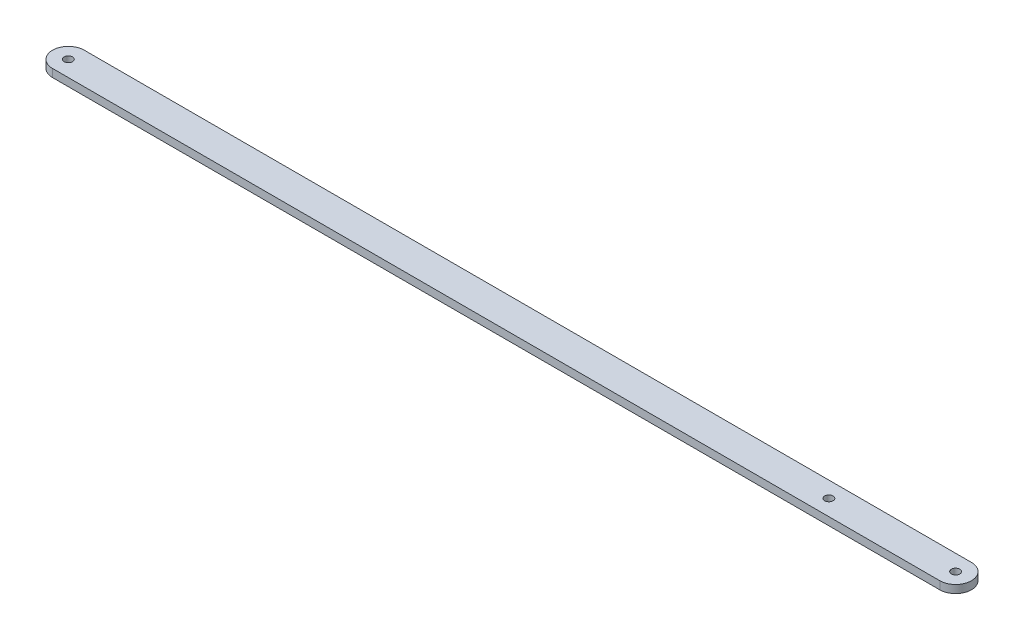
ISO-10303-21;
HEADER;
FILE_DESCRIPTION(('STEP AP214'),'2;1');
FILE_NAME('part.step','',(''),(''),'','','');
FILE_SCHEMA(('AUTOMOTIVE_DESIGN { 1 0 10303 214 1 1 1 1 }'));
ENDSEC;
DATA;
#1=APPLICATION_CONTEXT('core data for automotive mechanical design processes');
#2=APPLICATION_PROTOCOL_DEFINITION('international standard','automotive_design',2000,#1);
#3=PRODUCT_CONTEXT('',#1,'mechanical');
#4=PRODUCT('Part','Part','',(#3));
#5=PRODUCT_RELATED_PRODUCT_CATEGORY('part','',(#4));
#6=PRODUCT_DEFINITION_FORMATION('','',#4);
#7=PRODUCT_DEFINITION_CONTEXT('part definition',#1,'design');
#8=PRODUCT_DEFINITION('design','',#6,#7);
#9=PRODUCT_DEFINITION_SHAPE('','',#8);
#10=(LENGTH_UNIT() NAMED_UNIT(*) SI_UNIT(.MILLI.,.METRE.));
#11=(NAMED_UNIT(*) PLANE_ANGLE_UNIT() SI_UNIT($,.RADIAN.));
#12=(NAMED_UNIT(*) SI_UNIT($,.STERADIAN.) SOLID_ANGLE_UNIT());
#13=UNCERTAINTY_MEASURE_WITH_UNIT(LENGTH_MEASURE(1.E-05),#10,'distance_accuracy_value','');
#14=(GEOMETRIC_REPRESENTATION_CONTEXT(3) GLOBAL_UNCERTAINTY_ASSIGNED_CONTEXT((#13)) GLOBAL_UNIT_ASSIGNED_CONTEXT((#10,
#11,#12)) REPRESENTATION_CONTEXT('',''));
#15=CARTESIAN_POINT('',(0.,0.,0.));
#16=DIRECTION('',(0.,0.,1.));
#17=DIRECTION('',(1.,0.,0.));
#18=AXIS2_PLACEMENT_3D('',#15,#16,#17);
#19=CARTESIAN_POINT('',(-355.6,6.35,0.));
#20=DIRECTION('',(0.,1.,0.));
#21=DIRECTION('',(0.,0.,1.));
#22=AXIS2_PLACEMENT_3D('',#19,#20,#21);
#23=PLANE('',#22);
#24=CARTESIAN_POINT('',(254.,6.35,0.));
#25=DIRECTION('',(0.,1.,0.));
#26=DIRECTION('',(0.,0.,1.));
#27=AXIS2_PLACEMENT_3D('',#24,#25,#26);
#28=CIRCLE('',#27,3.36550000000002);
#29=CARTESIAN_POINT('',(254.,6.35,3.36550000000002));
#30=VERTEX_POINT('',#29);
#31=EDGE_CURVE('E134',#30,#30,#28,.T.);
#32=ORIENTED_EDGE('',*,*,#31,.F.);
#33=EDGE_LOOP('',(#32));
#34=FACE_BOUND('',#33,.T.);
#35=CARTESIAN_POINT('',(-355.6,6.35,0.));
#36=DIRECTION('',(0.,1.,0.));
#37=DIRECTION('',(0.,0.,1.));
#38=AXIS2_PLACEMENT_3D('',#35,#36,#37);
#39=CIRCLE('',#38,12.7);
#40=CARTESIAN_POINT('',(-355.6,6.35,-12.7000000000001));
#41=VERTEX_POINT('',#40);
#42=CARTESIAN_POINT('',(-355.6,6.35,12.6999999999999));
#43=VERTEX_POINT('',#42);
#44=EDGE_CURVE('E92',#41,#43,#39,.T.);
#45=ORIENTED_EDGE('',*,*,#44,.T.);
#46=DIRECTION('',(1.,0.,0.));
#47=VECTOR('',#46,1.);
#48=CARTESIAN_POINT('',(-355.6,6.35,12.6999999999999));
#49=LINE('',#48,#47);
#50=CARTESIAN_POINT('',(355.6,6.35,12.7000000000001));
#51=VERTEX_POINT('',#50);
#52=EDGE_CURVE('E87',#43,#51,#49,.T.);
#53=ORIENTED_EDGE('',*,*,#52,.T.);
#54=CARTESIAN_POINT('',(355.6,6.35,0.));
#55=DIRECTION('',(0.,1.,0.));
#56=DIRECTION('',(0.,0.,1.));
#57=AXIS2_PLACEMENT_3D('',#54,#55,#56);
#58=CIRCLE('',#57,12.7000000000001);
#59=CARTESIAN_POINT('',(355.6,6.35,-12.7000000000002));
#60=VERTEX_POINT('',#59);
#61=EDGE_CURVE('E90',#51,#60,#58,.T.);
#62=ORIENTED_EDGE('',*,*,#61,.T.);
#63=DIRECTION('',(-1.,0.,0.));
#64=VECTOR('',#63,1.);
#65=CARTESIAN_POINT('',(-355.6,6.35,-12.7000000000001));
#66=LINE('',#65,#64);
#67=EDGE_CURVE('E57',#60,#41,#66,.T.);
#68=ORIENTED_EDGE('',*,*,#67,.T.);
#69=EDGE_LOOP('',(#45,#53,#62,#68));
#70=FACE_BOUND('',#69,.T.);
#71=CARTESIAN_POINT('',(355.6,6.35,0.));
#72=DIRECTION('',(0.,1.,0.));
#73=DIRECTION('',(0.,0.,1.));
#74=AXIS2_PLACEMENT_3D('',#71,#72,#73);
#75=CIRCLE('',#74,3.36550000000002);
#76=CARTESIAN_POINT('',(355.6,6.35,3.36550000000002));
#77=VERTEX_POINT('',#76);
#78=EDGE_CURVE('E112',#77,#77,#75,.T.);
#79=ORIENTED_EDGE('',*,*,#78,.F.);
#80=EDGE_LOOP('',(#79));
#81=FACE_BOUND('',#80,.T.);
#82=CARTESIAN_POINT('',(-355.6,6.35,0.));
#83=DIRECTION('',(0.,1.,0.));
#84=DIRECTION('',(0.,0.,1.));
#85=AXIS2_PLACEMENT_3D('',#82,#83,#84);
#86=CIRCLE('',#85,3.36550000000002);
#87=CARTESIAN_POINT('',(-355.6,6.35,3.36550000000002));
#88=VERTEX_POINT('',#87);
#89=EDGE_CURVE('E142',#88,#88,#86,.T.);
#90=ORIENTED_EDGE('',*,*,#89,.F.);
#91=EDGE_LOOP('',(#90));
#92=FACE_BOUND('',#91,.T.);
#93=ADVANCED_FACE('F39',(#34,#70,#81,#92),#23,.T.);
#94=CARTESIAN_POINT('',(-355.6,0.,0.));
#95=DIRECTION('',(0.,1.,0.));
#96=DIRECTION('',(0.,0.,1.));
#97=AXIS2_PLACEMENT_3D('',#94,#95,#96);
#98=PLANE('',#97);
#99=CARTESIAN_POINT('',(-355.6,0.,0.));
#100=DIRECTION('',(0.,1.,0.));
#101=DIRECTION('',(0.,0.,1.));
#102=AXIS2_PLACEMENT_3D('',#99,#100,#101);
#103=CIRCLE('',#102,12.7);
#104=CARTESIAN_POINT('',(-355.6,0.,-12.7000000000001));
#105=VERTEX_POINT('',#104);
#106=CARTESIAN_POINT('',(-355.6,0.,12.6999999999999));
#107=VERTEX_POINT('',#106);
#108=EDGE_CURVE('E108',#105,#107,#103,.T.);
#109=ORIENTED_EDGE('',*,*,#108,.F.);
#110=DIRECTION('',(-1.,0.,0.));
#111=VECTOR('',#110,1.);
#112=CARTESIAN_POINT('',(-355.6,0.,-12.7000000000001));
#113=LINE('',#112,#111);
#114=CARTESIAN_POINT('',(355.6,0.,-12.7000000000002));
#115=VERTEX_POINT('',#114);
#116=EDGE_CURVE('E80',#115,#105,#113,.T.);
#117=ORIENTED_EDGE('',*,*,#116,.F.);
#118=CARTESIAN_POINT('',(355.6,0.,0.));
#119=DIRECTION('',(0.,1.,0.));
#120=DIRECTION('',(0.,0.,1.));
#121=AXIS2_PLACEMENT_3D('',#118,#119,#120);
#122=CIRCLE('',#121,12.7000000000001);
#123=CARTESIAN_POINT('',(355.6,0.,12.7000000000001));
#124=VERTEX_POINT('',#123);
#125=EDGE_CURVE('E74',#124,#115,#122,.T.);
#126=ORIENTED_EDGE('',*,*,#125,.F.);
#127=DIRECTION('',(1.,0.,0.));
#128=VECTOR('',#127,1.);
#129=CARTESIAN_POINT('',(-355.6,0.,12.6999999999999));
#130=LINE('',#129,#128);
#131=EDGE_CURVE('E97',#107,#124,#130,.T.);
#132=ORIENTED_EDGE('',*,*,#131,.F.);
#133=EDGE_LOOP('',(#109,#117,#126,#132));
#134=FACE_BOUND('',#133,.T.);
#135=CARTESIAN_POINT('',(355.6,0.,0.));
#136=DIRECTION('',(0.,1.,0.));
#137=DIRECTION('',(0.,0.,1.));
#138=AXIS2_PLACEMENT_3D('',#135,#136,#137);
#139=CIRCLE('',#138,3.36550000000002);
#140=CARTESIAN_POINT('',(355.6,0.,3.36550000000002));
#141=VERTEX_POINT('',#140);
#142=EDGE_CURVE('E130',#141,#141,#139,.T.);
#143=ORIENTED_EDGE('',*,*,#142,.T.);
#144=EDGE_LOOP('',(#143));
#145=FACE_BOUND('',#144,.T.);
#146=CARTESIAN_POINT('',(254.,0.,0.));
#147=DIRECTION('',(0.,1.,0.));
#148=DIRECTION('',(0.,0.,1.));
#149=AXIS2_PLACEMENT_3D('',#146,#147,#148);
#150=CIRCLE('',#149,3.36550000000002);
#151=CARTESIAN_POINT('',(254.,0.,3.36550000000002));
#152=VERTEX_POINT('',#151);
#153=EDGE_CURVE('E138',#152,#152,#150,.T.);
#154=ORIENTED_EDGE('',*,*,#153,.T.);
#155=EDGE_LOOP('',(#154));
#156=FACE_BOUND('',#155,.T.);
#157=CARTESIAN_POINT('',(-355.6,0.,0.));
#158=DIRECTION('',(0.,1.,0.));
#159=DIRECTION('',(0.,0.,1.));
#160=AXIS2_PLACEMENT_3D('',#157,#158,#159);
#161=CIRCLE('',#160,3.36550000000002);
#162=CARTESIAN_POINT('',(-355.6,0.,3.36550000000002));
#163=VERTEX_POINT('',#162);
#164=EDGE_CURVE('E146',#163,#163,#161,.T.);
#165=ORIENTED_EDGE('',*,*,#164,.T.);
#166=EDGE_LOOP('',(#165));
#167=FACE_BOUND('',#166,.T.);
#168=ADVANCED_FACE('F125',(#134,#145,#156,#167),#98,.F.);
#169=CARTESIAN_POINT('',(-355.6,6.35,0.));
#170=DIRECTION('',(0.,-1.,0.));
#171=DIRECTION('',(0.,0.,-1.));
#172=AXIS2_PLACEMENT_3D('',#169,#170,#171);
#173=CYLINDRICAL_SURFACE('',#172,12.7);
#174=ORIENTED_EDGE('',*,*,#108,.T.);
#175=DIRECTION('',(0.,-1.,0.));
#176=VECTOR('',#175,1.);
#177=CARTESIAN_POINT('',(-355.6,6.35,12.6999999999999));
#178=LINE('',#177,#176);
#179=EDGE_CURVE('E11',#43,#107,#178,.T.);
#180=ORIENTED_EDGE('',*,*,#179,.F.);
#181=ORIENTED_EDGE('',*,*,#44,.F.);
#182=DIRECTION('',(0.,-1.,0.));
#183=VECTOR('',#182,1.);
#184=CARTESIAN_POINT('',(-355.6,6.35,-12.7000000000001));
#185=LINE('',#184,#183);
#186=EDGE_CURVE('E104',#41,#105,#185,.T.);
#187=ORIENTED_EDGE('',*,*,#186,.T.);
#188=EDGE_LOOP('',(#174,#180,#181,#187));
#189=FACE_BOUND('',#188,.T.);
#190=ADVANCED_FACE('F41',(#189),#173,.T.);
#191=CARTESIAN_POINT('',(-355.6,6.35,12.6999999999999));
#192=DIRECTION('',(0.,0.,-1.));
#193=DIRECTION('',(-1.,0.,0.));
#194=AXIS2_PLACEMENT_3D('',#191,#192,#193);
#195=PLANE('',#194);
#196=ORIENTED_EDGE('',*,*,#131,.T.);
#197=DIRECTION('',(0.,-1.,0.));
#198=VECTOR('',#197,1.);
#199=CARTESIAN_POINT('',(355.6,6.35,12.7000000000001));
#200=LINE('',#199,#198);
#201=EDGE_CURVE('E49',#51,#124,#200,.T.);
#202=ORIENTED_EDGE('',*,*,#201,.F.);
#203=ORIENTED_EDGE('',*,*,#52,.F.);
#204=ORIENTED_EDGE('',*,*,#179,.T.);
#205=EDGE_LOOP('',(#196,#202,#203,#204));
#206=FACE_BOUND('',#205,.T.);
#207=ADVANCED_FACE('F96',(#206),#195,.F.);
#208=CARTESIAN_POINT('',(355.6,6.35,0.));
#209=DIRECTION('',(0.,-1.,0.));
#210=DIRECTION('',(0.,0.,-1.));
#211=AXIS2_PLACEMENT_3D('',#208,#209,#210);
#212=CYLINDRICAL_SURFACE('',#211,12.7000000000001);
#213=ORIENTED_EDGE('',*,*,#125,.T.);
#214=DIRECTION('',(0.,-1.,0.));
#215=VECTOR('',#214,1.);
#216=CARTESIAN_POINT('',(355.6,6.35,-12.7000000000002));
#217=LINE('',#216,#215);
#218=EDGE_CURVE('E99',#60,#115,#217,.T.);
#219=ORIENTED_EDGE('',*,*,#218,.F.);
#220=ORIENTED_EDGE('',*,*,#61,.F.);
#221=ORIENTED_EDGE('',*,*,#201,.T.);
#222=EDGE_LOOP('',(#213,#219,#220,#221));
#223=FACE_BOUND('',#222,.T.);
#224=ADVANCED_FACE('F100',(#223),#212,.T.);
#225=CARTESIAN_POINT('',(-355.6,6.35,-12.7000000000001));
#226=DIRECTION('',(0.,0.,1.));
#227=DIRECTION('',(1.,0.,0.));
#228=AXIS2_PLACEMENT_3D('',#225,#226,#227);
#229=PLANE('',#228);
#230=ORIENTED_EDGE('',*,*,#116,.T.);
#231=ORIENTED_EDGE('',*,*,#186,.F.);
#232=ORIENTED_EDGE('',*,*,#67,.F.);
#233=ORIENTED_EDGE('',*,*,#218,.T.);
#234=EDGE_LOOP('',(#230,#231,#232,#233));
#235=FACE_BOUND('',#234,.T.);
#236=ADVANCED_FACE('F122',(#235),#229,.F.);
#237=CARTESIAN_POINT('',(355.6,6.35,0.));
#238=DIRECTION('',(0.,-1.,0.));
#239=DIRECTION('',(0.,0.,-1.));
#240=AXIS2_PLACEMENT_3D('',#237,#238,#239);
#241=CYLINDRICAL_SURFACE('',#240,3.36550000000002);
#242=ORIENTED_EDGE('',*,*,#78,.T.);
#243=EDGE_LOOP('',(#242));
#244=FACE_BOUND('',#243,.T.);
#245=ORIENTED_EDGE('',*,*,#142,.F.);
#246=EDGE_LOOP('',(#245));
#247=FACE_BOUND('',#246,.T.);
#248=ADVANCED_FACE('F166',(#244,#247),#241,.F.);
#249=CARTESIAN_POINT('',(254.,6.35,0.));
#250=DIRECTION('',(0.,-1.,0.));
#251=DIRECTION('',(0.,0.,-1.));
#252=AXIS2_PLACEMENT_3D('',#249,#250,#251);
#253=CYLINDRICAL_SURFACE('',#252,3.36550000000002);
#254=ORIENTED_EDGE('',*,*,#31,.T.);
#255=EDGE_LOOP('',(#254));
#256=FACE_BOUND('',#255,.T.);
#257=ORIENTED_EDGE('',*,*,#153,.F.);
#258=EDGE_LOOP('',(#257));
#259=FACE_BOUND('',#258,.T.);
#260=ADVANCED_FACE('F212',(#256,#259),#253,.F.);
#261=CARTESIAN_POINT('',(-355.6,6.35,0.));
#262=DIRECTION('',(0.,-1.,0.));
#263=DIRECTION('',(0.,0.,-1.));
#264=AXIS2_PLACEMENT_3D('',#261,#262,#263);
#265=CYLINDRICAL_SURFACE('',#264,3.36550000000002);
#266=ORIENTED_EDGE('',*,*,#89,.T.);
#267=EDGE_LOOP('',(#266));
#268=FACE_BOUND('',#267,.T.);
#269=ORIENTED_EDGE('',*,*,#164,.F.);
#270=EDGE_LOOP('',(#269));
#271=FACE_BOUND('',#270,.T.);
#272=ADVANCED_FACE('F154',(#268,#271),#265,.F.);
#273=CLOSED_SHELL('',(#93,#168,#190,#207,#224,#236,#248,#260,#272));
#274=MANIFOLD_SOLID_BREP('B2',#273);
#275=ADVANCED_BREP_SHAPE_REPRESENTATION('',(#18,#274),#14);
#276=SHAPE_DEFINITION_REPRESENTATION(#9,#275);
ENDSEC;
END-ISO-10303-21;
